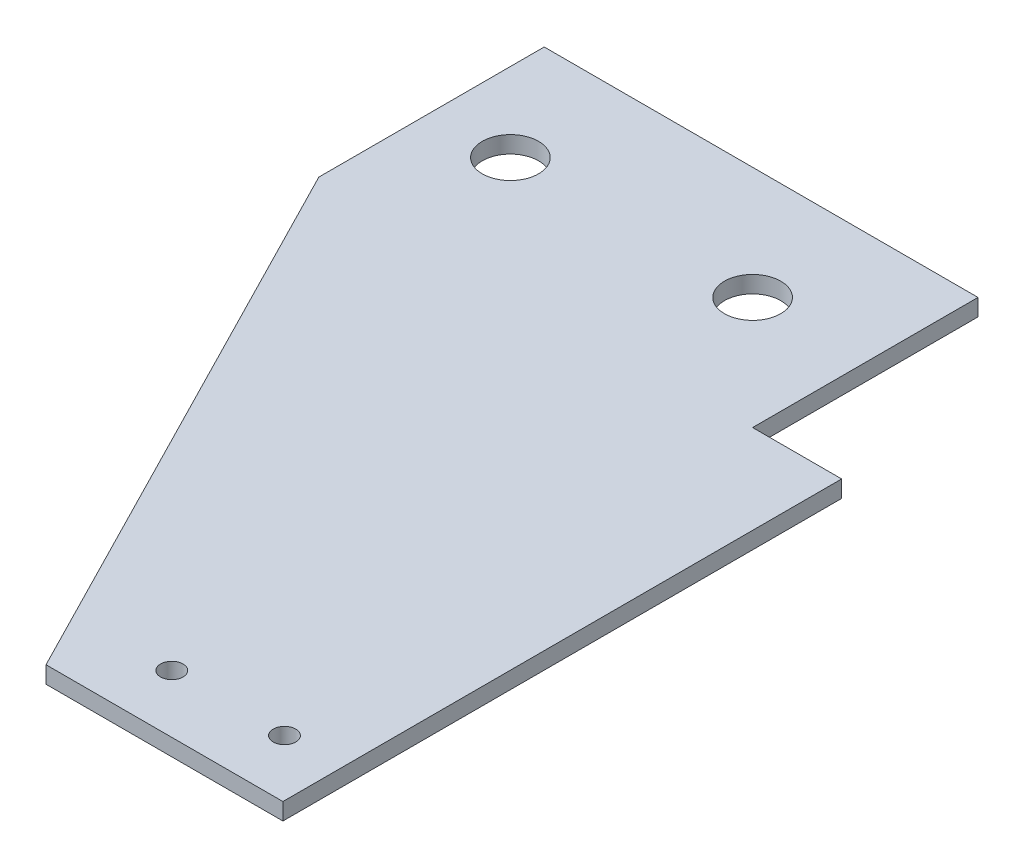
ISO-10303-21;
HEADER;
FILE_DESCRIPTION(('STEP AP214'),'2;1');
FILE_NAME('part.step','',(''),(''),'','','');
FILE_SCHEMA(('AUTOMOTIVE_DESIGN { 1 0 10303 214 1 1 1 1 }'));
ENDSEC;
DATA;
#1=APPLICATION_CONTEXT('core data for automotive mechanical design processes');
#2=APPLICATION_PROTOCOL_DEFINITION('international standard','automotive_design',2000,#1);
#3=PRODUCT_CONTEXT('',#1,'mechanical');
#4=PRODUCT('Part','Part','',(#3));
#5=PRODUCT_RELATED_PRODUCT_CATEGORY('part','',(#4));
#6=PRODUCT_DEFINITION_FORMATION('','',#4);
#7=PRODUCT_DEFINITION_CONTEXT('part definition',#1,'design');
#8=PRODUCT_DEFINITION('design','',#6,#7);
#9=PRODUCT_DEFINITION_SHAPE('','',#8);
#10=(LENGTH_UNIT() NAMED_UNIT(*) SI_UNIT(.MILLI.,.METRE.));
#11=(NAMED_UNIT(*) PLANE_ANGLE_UNIT() SI_UNIT($,.RADIAN.));
#12=(NAMED_UNIT(*) SI_UNIT($,.STERADIAN.) SOLID_ANGLE_UNIT());
#13=UNCERTAINTY_MEASURE_WITH_UNIT(LENGTH_MEASURE(1.E-05),#10,'distance_accuracy_value','');
#14=(GEOMETRIC_REPRESENTATION_CONTEXT(3) GLOBAL_UNCERTAINTY_ASSIGNED_CONTEXT((#13)) GLOBAL_UNIT_ASSIGNED_CONTEXT((#10,
#11,#12)) REPRESENTATION_CONTEXT('',''));
#15=CARTESIAN_POINT('',(0.,0.,0.));
#16=DIRECTION('',(0.,0.,1.));
#17=DIRECTION('',(1.,0.,0.));
#18=AXIS2_PLACEMENT_3D('',#15,#16,#17);
#19=CARTESIAN_POINT('',(0.,1.5,-2.));
#20=DIRECTION('',(0.,0.,-1.));
#21=DIRECTION('',(-1.,0.,0.));
#22=AXIS2_PLACEMENT_3D('',#19,#20,#21);
#23=PLANE('',#22);
#24=DIRECTION('',(1.,0.,0.));
#25=VECTOR('',#24,1.);
#26=CARTESIAN_POINT('',(0.,0.,-2.));
#27=LINE('',#26,#25);
#28=CARTESIAN_POINT('',(-21.0233847751049,0.,-2.));
#29=VERTEX_POINT('',#28);
#30=CARTESIAN_POINT('',(0.,0.,-2.));
#31=VERTEX_POINT('',#30);
#32=EDGE_CURVE('E140',#29,#31,#27,.T.);
#33=ORIENTED_EDGE('',*,*,#32,.T.);
#34=DIRECTION('',(0.,-1.,0.));
#35=VECTOR('',#34,1.);
#36=CARTESIAN_POINT('',(0.,1.5,-2.));
#37=LINE('',#36,#35);
#38=CARTESIAN_POINT('',(0.,1.5,-2.));
#39=VERTEX_POINT('',#38);
#40=EDGE_CURVE('E11',#39,#31,#37,.T.);
#41=ORIENTED_EDGE('',*,*,#40,.F.);
#42=DIRECTION('',(1.,0.,0.));
#43=VECTOR('',#42,1.);
#44=CARTESIAN_POINT('',(0.,1.5,-2.));
#45=LINE('',#44,#43);
#46=CARTESIAN_POINT('',(-21.0233847751049,1.5,-2.));
#47=VERTEX_POINT('',#46);
#48=EDGE_CURVE('E87',#47,#39,#45,.T.);
#49=ORIENTED_EDGE('',*,*,#48,.F.);
#50=DIRECTION('',(0.,-1.,0.));
#51=VECTOR('',#50,1.);
#52=CARTESIAN_POINT('',(-21.0233847751049,1.5,-2.));
#53=LINE('',#52,#51);
#54=EDGE_CURVE('E52',#47,#29,#53,.T.);
#55=ORIENTED_EDGE('',*,*,#54,.T.);
#56=EDGE_LOOP('',(#33,#41,#49,#55));
#57=FACE_BOUND('',#56,.T.);
#58=ADVANCED_FACE('F36',(#57),#23,.F.);
#59=CARTESIAN_POINT('',(0.,1.5,0.));
#60=DIRECTION('',(1.,0.,0.));
#61=DIRECTION('',(0.,0.,-1.));
#62=AXIS2_PLACEMENT_3D('',#59,#60,#61);
#63=PLANE('',#62);
#64=DIRECTION('',(0.,0.,1.));
#65=VECTOR('',#64,1.);
#66=CARTESIAN_POINT('',(0.,0.,0.));
#67=LINE('',#66,#65);
#68=CARTESIAN_POINT('',(0.,0.,-51.5800000000056));
#69=VERTEX_POINT('',#68);
#70=EDGE_CURVE('E142',#69,#31,#67,.T.);
#71=ORIENTED_EDGE('',*,*,#70,.F.);
#72=DIRECTION('',(0.,-1.,0.));
#73=VECTOR('',#72,1.);
#74=CARTESIAN_POINT('',(0.,1.5,-51.5800000000056));
#75=LINE('',#74,#73);
#76=CARTESIAN_POINT('',(0.,1.5,-51.5800000000056));
#77=VERTEX_POINT('',#76);
#78=EDGE_CURVE('E44',#77,#69,#75,.T.);
#79=ORIENTED_EDGE('',*,*,#78,.F.);
#80=DIRECTION('',(0.,0.,1.));
#81=VECTOR('',#80,1.);
#82=CARTESIAN_POINT('',(0.,1.5,0.));
#83=LINE('',#82,#81);
#84=EDGE_CURVE('E187',#77,#39,#83,.T.);
#85=ORIENTED_EDGE('',*,*,#84,.T.);
#86=ORIENTED_EDGE('',*,*,#40,.T.);
#87=EDGE_LOOP('',(#71,#79,#85,#86));
#88=FACE_BOUND('',#87,.T.);
#89=ADVANCED_FACE('F180',(#88),#63,.T.);
#90=CARTESIAN_POINT('',(0.,1.5,-51.5800000000056));
#91=DIRECTION('',(0.,0.,-1.));
#92=DIRECTION('',(-1.,0.,0.));
#93=AXIS2_PLACEMENT_3D('',#90,#91,#92);
#94=PLANE('',#93);
#95=DIRECTION('',(1.,0.,0.));
#96=VECTOR('',#95,1.);
#97=CARTESIAN_POINT('',(0.,0.,-51.5800000000056));
#98=LINE('',#97,#96);
#99=CARTESIAN_POINT('',(-7.8999999999636,0.,-51.5800000000056));
#100=VERTEX_POINT('',#99);
#101=EDGE_CURVE('E145',#100,#69,#98,.T.);
#102=ORIENTED_EDGE('',*,*,#101,.F.);
#103=DIRECTION('',(0.,-1.,0.));
#104=VECTOR('',#103,1.);
#105=CARTESIAN_POINT('',(-7.8999999999636,1.5,-51.5800000000056));
#106=LINE('',#105,#104);
#107=CARTESIAN_POINT('',(-7.8999999999636,1.5,-51.5800000000056));
#108=VERTEX_POINT('',#107);
#109=EDGE_CURVE('E172',#108,#100,#106,.T.);
#110=ORIENTED_EDGE('',*,*,#109,.F.);
#111=DIRECTION('',(1.,0.,0.));
#112=VECTOR('',#111,1.);
#113=CARTESIAN_POINT('',(0.,1.5,-51.5800000000056));
#114=LINE('',#113,#112);
#115=EDGE_CURVE('E123',#108,#77,#114,.T.);
#116=ORIENTED_EDGE('',*,*,#115,.T.);
#117=ORIENTED_EDGE('',*,*,#78,.T.);
#118=EDGE_LOOP('',(#102,#110,#116,#117));
#119=FACE_BOUND('',#118,.T.);
#120=ADVANCED_FACE('F177',(#119),#94,.T.);
#121=CARTESIAN_POINT('',(-7.8999999999636,1.5,0.));
#122=DIRECTION('',(1.,0.,0.));
#123=DIRECTION('',(0.,0.,-1.));
#124=AXIS2_PLACEMENT_3D('',#121,#122,#123);
#125=PLANE('',#124);
#126=DIRECTION('',(0.,0.,1.));
#127=VECTOR('',#126,1.);
#128=CARTESIAN_POINT('',(-7.8999999999636,0.,0.));
#129=LINE('',#128,#127);
#130=CARTESIAN_POINT('',(-7.8999999999636,0.,-71.5800000000056));
#131=VERTEX_POINT('',#130);
#132=EDGE_CURVE('E148',#131,#100,#129,.T.);
#133=ORIENTED_EDGE('',*,*,#132,.F.);
#134=DIRECTION('',(0.,-1.,0.));
#135=VECTOR('',#134,1.);
#136=CARTESIAN_POINT('',(-7.8999999999636,1.5,-71.5800000000056));
#137=LINE('',#136,#135);
#138=CARTESIAN_POINT('',(-7.8999999999636,1.5,-71.5800000000056));
#139=VERTEX_POINT('',#138);
#140=EDGE_CURVE('E110',#139,#131,#137,.T.);
#141=ORIENTED_EDGE('',*,*,#140,.F.);
#142=DIRECTION('',(0.,0.,1.));
#143=VECTOR('',#142,1.);
#144=CARTESIAN_POINT('',(-7.8999999999636,1.5,0.));
#145=LINE('',#144,#143);
#146=EDGE_CURVE('E121',#139,#108,#145,.T.);
#147=ORIENTED_EDGE('',*,*,#146,.T.);
#148=ORIENTED_EDGE('',*,*,#109,.T.);
#149=EDGE_LOOP('',(#133,#141,#147,#148));
#150=FACE_BOUND('',#149,.T.);
#151=ADVANCED_FACE('F186',(#150),#125,.T.);
#152=CARTESIAN_POINT('',(0.,1.5,-71.5800000000056));
#153=DIRECTION('',(0.,0.,-1.));
#154=DIRECTION('',(-1.,0.,0.));
#155=AXIS2_PLACEMENT_3D('',#152,#153,#154);
#156=PLANE('',#155);
#157=DIRECTION('',(1.,0.,0.));
#158=VECTOR('',#157,1.);
#159=CARTESIAN_POINT('',(0.,0.,-71.5800000000056));
#160=LINE('',#159,#158);
#161=CARTESIAN_POINT('',(-46.3930933499583,0.,-71.5800000000056));
#162=VERTEX_POINT('',#161);
#163=EDGE_CURVE('E107',#162,#131,#160,.T.);
#164=ORIENTED_EDGE('',*,*,#163,.F.);
#165=DIRECTION('',(0.,-1.,0.));
#166=VECTOR('',#165,1.);
#167=CARTESIAN_POINT('',(-46.3930933499583,1.5,-71.5800000000056));
#168=LINE('',#167,#166);
#169=CARTESIAN_POINT('',(-46.3930933499583,1.5,-71.5800000000056));
#170=VERTEX_POINT('',#169);
#171=EDGE_CURVE('E101',#170,#162,#168,.T.);
#172=ORIENTED_EDGE('',*,*,#171,.F.);
#173=DIRECTION('',(1.,0.,0.));
#174=VECTOR('',#173,1.);
#175=CARTESIAN_POINT('',(0.,1.5,-71.5800000000056));
#176=LINE('',#175,#174);
#177=EDGE_CURVE('E105',#170,#139,#176,.T.);
#178=ORIENTED_EDGE('',*,*,#177,.T.);
#179=ORIENTED_EDGE('',*,*,#140,.T.);
#180=EDGE_LOOP('',(#164,#172,#178,#179));
#181=FACE_BOUND('',#180,.T.);
#182=ADVANCED_FACE('F103',(#181),#156,.T.);
#183=CARTESIAN_POINT('',(-46.3930933499583,1.5,0.));
#184=DIRECTION('',(1.,0.,0.));
#185=DIRECTION('',(0.,0.,-1.));
#186=AXIS2_PLACEMENT_3D('',#183,#184,#185);
#187=PLANE('',#186);
#188=DIRECTION('',(0.,0.,1.));
#189=VECTOR('',#188,1.);
#190=CARTESIAN_POINT('',(-46.3930933499583,0.,0.));
#191=LINE('',#190,#189);
#192=CARTESIAN_POINT('',(-46.3930933499583,0.,-51.5800000000056));
#193=VERTEX_POINT('',#192);
#194=EDGE_CURVE('E152',#162,#193,#191,.T.);
#195=ORIENTED_EDGE('',*,*,#194,.T.);
#196=DIRECTION('',(0.,-1.,0.));
#197=VECTOR('',#196,1.);
#198=CARTESIAN_POINT('',(-46.3930933499583,1.5,-51.5800000000056));
#199=LINE('',#198,#197);
#200=CARTESIAN_POINT('',(-46.3930933499583,1.5,-51.5800000000056));
#201=VERTEX_POINT('',#200);
#202=EDGE_CURVE('E75',#201,#193,#199,.T.);
#203=ORIENTED_EDGE('',*,*,#202,.F.);
#204=DIRECTION('',(0.,0.,1.));
#205=VECTOR('',#204,1.);
#206=CARTESIAN_POINT('',(-46.3930933499583,1.5,0.));
#207=LINE('',#206,#205);
#208=EDGE_CURVE('E112',#170,#201,#207,.T.);
#209=ORIENTED_EDGE('',*,*,#208,.F.);
#210=ORIENTED_EDGE('',*,*,#171,.T.);
#211=EDGE_LOOP('',(#195,#203,#209,#210));
#212=FACE_BOUND('',#211,.T.);
#213=ADVANCED_FACE('F113',(#212),#187,.F.);
#214=CARTESIAN_POINT('',(-5.,1.5,-7.14000000000004));
#215=DIRECTION('',(0.,-1.,0.));
#216=DIRECTION('',(0.,0.,-1.));
#217=AXIS2_PLACEMENT_3D('',#214,#215,#216);
#218=CYLINDRICAL_SURFACE('',#217,0.999999999999998);
#219=CARTESIAN_POINT('',(-5.,1.5,-7.14000000000004));
#220=DIRECTION('',(0.,1.,0.));
#221=DIRECTION('',(0.,0.,1.));
#222=AXIS2_PLACEMENT_3D('',#219,#220,#221);
#223=CIRCLE('',#222,0.999999999999998);
#224=CARTESIAN_POINT('',(-5.,1.5,-6.14000000000004));
#225=VERTEX_POINT('',#224);
#226=EDGE_CURVE('E134',#225,#225,#223,.T.);
#227=ORIENTED_EDGE('',*,*,#226,.T.);
#228=EDGE_LOOP('',(#227));
#229=FACE_BOUND('',#228,.T.);
#230=CARTESIAN_POINT('',(-5.,0.,-7.14000000000004));
#231=DIRECTION('',(0.,1.,0.));
#232=DIRECTION('',(0.,0.,1.));
#233=AXIS2_PLACEMENT_3D('',#230,#231,#232);
#234=CIRCLE('',#233,0.999999999999998);
#235=CARTESIAN_POINT('',(-5.,0.,-6.14000000000004));
#236=VERTEX_POINT('',#235);
#237=EDGE_CURVE('E163',#236,#236,#234,.T.);
#238=ORIENTED_EDGE('',*,*,#237,.F.);
#239=EDGE_LOOP('',(#238));
#240=FACE_BOUND('',#239,.T.);
#241=ADVANCED_FACE('F219',(#229,#240),#218,.F.);
#242=CARTESIAN_POINT('',(-39.3930933499583,1.5,-61.5800000000056));
#243=DIRECTION('',(0.,-1.,0.));
#244=DIRECTION('',(0.,0.,-1.));
#245=AXIS2_PLACEMENT_3D('',#242,#243,#244);
#246=CYLINDRICAL_SURFACE('',#245,2.5);
#247=CARTESIAN_POINT('',(-39.3930933499583,1.5,-61.5800000000056));
#248=DIRECTION('',(0.,1.,0.));
#249=DIRECTION('',(0.,0.,1.));
#250=AXIS2_PLACEMENT_3D('',#247,#248,#249);
#251=CIRCLE('',#250,2.5);
#252=CARTESIAN_POINT('',(-39.3930933499583,1.5,-59.0800000000056));
#253=VERTEX_POINT('',#252);
#254=EDGE_CURVE('E131',#253,#253,#251,.T.);
#255=ORIENTED_EDGE('',*,*,#254,.T.);
#256=EDGE_LOOP('',(#255));
#257=FACE_BOUND('',#256,.T.);
#258=CARTESIAN_POINT('',(-39.3930933499583,0.,-61.5800000000056));
#259=DIRECTION('',(0.,1.,0.));
#260=DIRECTION('',(0.,0.,1.));
#261=AXIS2_PLACEMENT_3D('',#258,#259,#260);
#262=CIRCLE('',#261,2.5);
#263=CARTESIAN_POINT('',(-39.3930933499583,0.,-59.0800000000056));
#264=VERTEX_POINT('',#263);
#265=EDGE_CURVE('E160',#264,#264,#262,.T.);
#266=ORIENTED_EDGE('',*,*,#265,.F.);
#267=EDGE_LOOP('',(#266));
#268=FACE_BOUND('',#267,.T.);
#269=ADVANCED_FACE('F213',(#257,#268),#246,.F.);
#270=CARTESIAN_POINT('',(-17.8999999999636,1.5,-61.5800000000056));
#271=DIRECTION('',(0.,-1.,0.));
#272=DIRECTION('',(0.,0.,-1.));
#273=AXIS2_PLACEMENT_3D('',#270,#271,#272);
#274=CYLINDRICAL_SURFACE('',#273,2.5);
#275=CARTESIAN_POINT('',(-17.8999999999636,1.5,-61.5800000000056));
#276=DIRECTION('',(0.,1.,0.));
#277=DIRECTION('',(0.,0.,1.));
#278=AXIS2_PLACEMENT_3D('',#275,#276,#277);
#279=CIRCLE('',#278,2.5);
#280=CARTESIAN_POINT('',(-17.8999999999636,1.5,-59.0800000000056));
#281=VERTEX_POINT('',#280);
#282=EDGE_CURVE('E128',#281,#281,#279,.T.);
#283=ORIENTED_EDGE('',*,*,#282,.T.);
#284=EDGE_LOOP('',(#283));
#285=FACE_BOUND('',#284,.T.);
#286=CARTESIAN_POINT('',(-17.8999999999636,0.,-61.5800000000056));
#287=DIRECTION('',(0.,1.,0.));
#288=DIRECTION('',(0.,0.,1.));
#289=AXIS2_PLACEMENT_3D('',#286,#287,#288);
#290=CIRCLE('',#289,2.5);
#291=CARTESIAN_POINT('',(-17.8999999999636,0.,-59.0800000000056));
#292=VERTEX_POINT('',#291);
#293=EDGE_CURVE('E157',#292,#292,#290,.T.);
#294=ORIENTED_EDGE('',*,*,#293,.F.);
#295=EDGE_LOOP('',(#294));
#296=FACE_BOUND('',#295,.T.);
#297=ADVANCED_FACE('F205',(#285,#296),#274,.F.);
#298=CARTESIAN_POINT('',(-15.8500069528083,1.5,8.11032790040542));
#299=DIRECTION('',(-0.890224885992531,0.,0.455521297372126));
#300=DIRECTION('',(0.455521297372126,0.,0.890224885992531));
#301=AXIS2_PLACEMENT_3D('',#298,#299,#300);
#302=PLANE('',#301);
#303=DIRECTION('',(-0.455521297372126,0.,-0.890224885992531));
#304=VECTOR('',#303,1.);
#305=CARTESIAN_POINT('',(-15.8500069528083,0.,8.11032790040542));
#306=LINE('',#305,#304);
#307=EDGE_CURVE('E154',#29,#193,#306,.T.);
#308=ORIENTED_EDGE('',*,*,#307,.F.);
#309=ORIENTED_EDGE('',*,*,#54,.F.);
#310=DIRECTION('',(-0.455521297372126,0.,-0.890224885992531));
#311=VECTOR('',#310,1.);
#312=CARTESIAN_POINT('',(-15.8500069528083,1.5,8.11032790040542));
#313=LINE('',#312,#311);
#314=EDGE_CURVE('E114',#47,#201,#313,.T.);
#315=ORIENTED_EDGE('',*,*,#314,.T.);
#316=ORIENTED_EDGE('',*,*,#202,.T.);
#317=EDGE_LOOP('',(#308,#309,#315,#316));
#318=FACE_BOUND('',#317,.T.);
#319=ADVANCED_FACE('F202',(#318),#302,.T.);
#320=CARTESIAN_POINT('',(-15.,1.5,-7.14000000000004));
#321=DIRECTION('',(0.,-1.,0.));
#322=DIRECTION('',(0.,0.,-1.));
#323=AXIS2_PLACEMENT_3D('',#320,#321,#322);
#324=CYLINDRICAL_SURFACE('',#323,0.999999999999998);
#325=CARTESIAN_POINT('',(-15.,1.5,-7.14000000000004));
#326=DIRECTION('',(0.,1.,0.));
#327=DIRECTION('',(0.,0.,1.));
#328=AXIS2_PLACEMENT_3D('',#325,#326,#327);
#329=CIRCLE('',#328,0.999999999999998);
#330=CARTESIAN_POINT('',(-15.,1.5,-6.14000000000004));
#331=VERTEX_POINT('',#330);
#332=EDGE_CURVE('E137',#331,#331,#329,.T.);
#333=ORIENTED_EDGE('',*,*,#332,.T.);
#334=EDGE_LOOP('',(#333));
#335=FACE_BOUND('',#334,.T.);
#336=CARTESIAN_POINT('',(-15.,0.,-7.14000000000004));
#337=DIRECTION('',(0.,1.,0.));
#338=DIRECTION('',(0.,0.,1.));
#339=AXIS2_PLACEMENT_3D('',#336,#337,#338);
#340=CIRCLE('',#339,0.999999999999998);
#341=CARTESIAN_POINT('',(-15.,0.,-6.14000000000004));
#342=VERTEX_POINT('',#341);
#343=EDGE_CURVE('E166',#342,#342,#340,.T.);
#344=ORIENTED_EDGE('',*,*,#343,.F.);
#345=EDGE_LOOP('',(#344));
#346=FACE_BOUND('',#345,.T.);
#347=ADVANCED_FACE('F204',(#335,#346),#324,.F.);
#348=CARTESIAN_POINT('',(0.,1.5,0.));
#349=DIRECTION('',(0.,1.,0.));
#350=DIRECTION('',(0.,0.,1.));
#351=AXIS2_PLACEMENT_3D('',#348,#349,#350);
#352=PLANE('',#351);
#353=ORIENTED_EDGE('',*,*,#48,.T.);
#354=ORIENTED_EDGE('',*,*,#84,.F.);
#355=ORIENTED_EDGE('',*,*,#115,.F.);
#356=ORIENTED_EDGE('',*,*,#146,.F.);
#357=ORIENTED_EDGE('',*,*,#177,.F.);
#358=ORIENTED_EDGE('',*,*,#208,.T.);
#359=ORIENTED_EDGE('',*,*,#314,.F.);
#360=EDGE_LOOP('',(#353,#354,#355,#356,#357,#358,#359));
#361=FACE_BOUND('',#360,.T.);
#362=ORIENTED_EDGE('',*,*,#282,.F.);
#363=EDGE_LOOP('',(#362));
#364=FACE_BOUND('',#363,.T.);
#365=ORIENTED_EDGE('',*,*,#254,.F.);
#366=EDGE_LOOP('',(#365));
#367=FACE_BOUND('',#366,.T.);
#368=ORIENTED_EDGE('',*,*,#226,.F.);
#369=EDGE_LOOP('',(#368));
#370=FACE_BOUND('',#369,.T.);
#371=ORIENTED_EDGE('',*,*,#332,.F.);
#372=EDGE_LOOP('',(#371));
#373=FACE_BOUND('',#372,.T.);
#374=ADVANCED_FACE('F117',(#361,#364,#367,#370,#373),#352,.T.);
#375=CARTESIAN_POINT('',(0.,0.,0.));
#376=DIRECTION('',(0.,1.,0.));
#377=DIRECTION('',(0.,0.,1.));
#378=AXIS2_PLACEMENT_3D('',#375,#376,#377);
#379=PLANE('',#378);
#380=ORIENTED_EDGE('',*,*,#32,.F.);
#381=ORIENTED_EDGE('',*,*,#307,.T.);
#382=ORIENTED_EDGE('',*,*,#194,.F.);
#383=ORIENTED_EDGE('',*,*,#163,.T.);
#384=ORIENTED_EDGE('',*,*,#132,.T.);
#385=ORIENTED_EDGE('',*,*,#101,.T.);
#386=ORIENTED_EDGE('',*,*,#70,.T.);
#387=EDGE_LOOP('',(#380,#381,#382,#383,#384,#385,#386));
#388=FACE_BOUND('',#387,.T.);
#389=ORIENTED_EDGE('',*,*,#293,.T.);
#390=EDGE_LOOP('',(#389));
#391=FACE_BOUND('',#390,.T.);
#392=ORIENTED_EDGE('',*,*,#265,.T.);
#393=EDGE_LOOP('',(#392));
#394=FACE_BOUND('',#393,.T.);
#395=ORIENTED_EDGE('',*,*,#237,.T.);
#396=EDGE_LOOP('',(#395));
#397=FACE_BOUND('',#396,.T.);
#398=ORIENTED_EDGE('',*,*,#343,.T.);
#399=EDGE_LOOP('',(#398));
#400=FACE_BOUND('',#399,.T.);
#401=ADVANCED_FACE('F182',(#388,#391,#394,#397,#400),#379,.F.);
#402=CLOSED_SHELL('',(#58,#89,#120,#151,#182,#213,#241,#269,#297,#319,#347,#374,#401));
#403=MANIFOLD_SOLID_BREP('B2',#402);
#404=ADVANCED_BREP_SHAPE_REPRESENTATION('',(#18,#403),#14);
#405=SHAPE_DEFINITION_REPRESENTATION(#9,#404);
ENDSEC;
END-ISO-10303-21;
